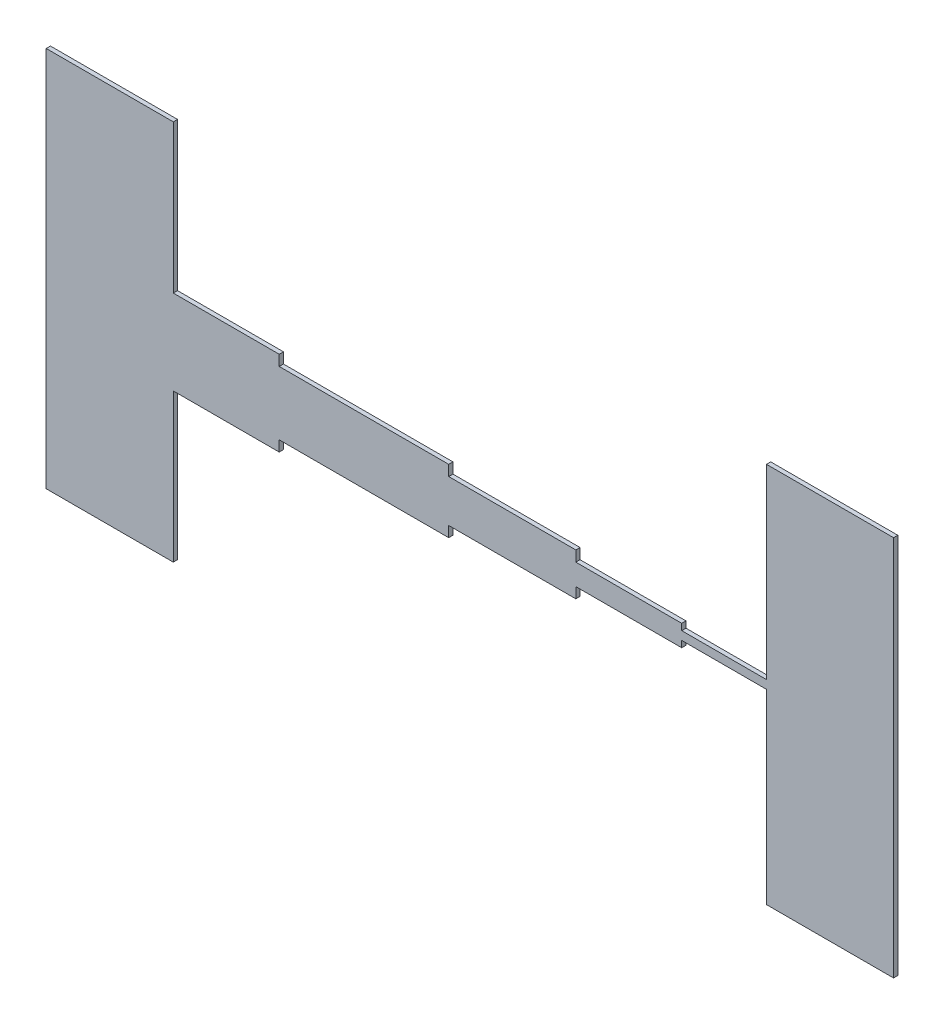
ISO-10303-21;
HEADER;
FILE_DESCRIPTION(('STEP AP214'),'2;1');
FILE_NAME('part.step','',(''),(''),'','','');
FILE_SCHEMA(('AUTOMOTIVE_DESIGN { 1 0 10303 214 1 1 1 1 }'));
ENDSEC;
DATA;
#1=APPLICATION_CONTEXT('core data for automotive mechanical design processes');
#2=APPLICATION_PROTOCOL_DEFINITION('international standard','automotive_design',2000,#1);
#3=PRODUCT_CONTEXT('',#1,'mechanical');
#4=PRODUCT('Part','Part','',(#3));
#5=PRODUCT_RELATED_PRODUCT_CATEGORY('part','',(#4));
#6=PRODUCT_DEFINITION_FORMATION('','',#4);
#7=PRODUCT_DEFINITION_CONTEXT('part definition',#1,'design');
#8=PRODUCT_DEFINITION('design','',#6,#7);
#9=PRODUCT_DEFINITION_SHAPE('','',#8);
#10=(LENGTH_UNIT() NAMED_UNIT(*) SI_UNIT(.MILLI.,.METRE.));
#11=(NAMED_UNIT(*) PLANE_ANGLE_UNIT() SI_UNIT($,.RADIAN.));
#12=(NAMED_UNIT(*) SI_UNIT($,.STERADIAN.) SOLID_ANGLE_UNIT());
#13=UNCERTAINTY_MEASURE_WITH_UNIT(LENGTH_MEASURE(1.E-05),#10,'distance_accuracy_value','');
#14=(GEOMETRIC_REPRESENTATION_CONTEXT(3) GLOBAL_UNCERTAINTY_ASSIGNED_CONTEXT((#13)) GLOBAL_UNIT_ASSIGNED_CONTEXT((#10,
#11,#12)) REPRESENTATION_CONTEXT('',''));
#15=CARTESIAN_POINT('',(0.,0.,0.));
#16=DIRECTION('',(0.,0.,1.));
#17=DIRECTION('',(1.,0.,0.));
#18=AXIS2_PLACEMENT_3D('',#15,#16,#17);
#19=CARTESIAN_POINT('',(-9507.17390524048,-4495.5,-50.05));
#20=DIRECTION('',(1.,0.,0.));
#21=DIRECTION('',(0.,0.,-1.));
#22=AXIS2_PLACEMENT_3D('',#19,#20,#21);
#23=PLANE('',#22);
#24=DIRECTION('',(0.,1.,0.));
#25=VECTOR('',#24,1.);
#26=CARTESIAN_POINT('',(-9507.17390524048,-4495.5,49.95));
#27=LINE('',#26,#25);
#28=CARTESIAN_POINT('',(-9507.17390524048,-4495.5,49.95));
#29=VERTEX_POINT('',#28);
#30=CARTESIAN_POINT('',(-9507.17390524048,4504.5,49.95));
#31=VERTEX_POINT('',#30);
#32=EDGE_CURVE('E268',#29,#31,#27,.T.);
#33=ORIENTED_EDGE('',*,*,#32,.T.);
#34=DIRECTION('',(0.,0.,1.));
#35=VECTOR('',#34,1.);
#36=CARTESIAN_POINT('',(-9507.17390524048,4504.5,-50.05));
#37=LINE('',#36,#35);
#38=CARTESIAN_POINT('',(-9507.17390524048,4504.5,-50.05));
#39=VERTEX_POINT('',#38);
#40=EDGE_CURVE('E11',#39,#31,#37,.T.);
#41=ORIENTED_EDGE('',*,*,#40,.F.);
#42=DIRECTION('',(0.,1.,0.));
#43=VECTOR('',#42,1.);
#44=CARTESIAN_POINT('',(-9507.17390524048,-4495.5,-50.05));
#45=LINE('',#44,#43);
#46=CARTESIAN_POINT('',(-9507.17390524048,-4495.5,-50.05));
#47=VERTEX_POINT('',#46);
#48=EDGE_CURVE('E366',#47,#39,#45,.T.);
#49=ORIENTED_EDGE('',*,*,#48,.F.);
#50=DIRECTION('',(0.,0.,1.));
#51=VECTOR('',#50,1.);
#52=CARTESIAN_POINT('',(-9507.17390524048,-4495.5,-50.05));
#53=LINE('',#52,#51);
#54=EDGE_CURVE('E60',#47,#29,#53,.T.);
#55=ORIENTED_EDGE('',*,*,#54,.T.);
#56=EDGE_LOOP('',(#33,#41,#49,#55));
#57=FACE_BOUND('',#56,.T.);
#58=ADVANCED_FACE('F43',(#57),#23,.F.);
#59=CARTESIAN_POINT('',(-9507.17390524048,4504.5,-50.05));
#60=DIRECTION('',(0.,-1.,0.));
#61=DIRECTION('',(0.,0.,-1.));
#62=AXIS2_PLACEMENT_3D('',#59,#60,#61);
#63=PLANE('',#62);
#64=DIRECTION('',(1.,0.,0.));
#65=VECTOR('',#64,1.);
#66=CARTESIAN_POINT('',(-9507.17390524048,4504.5,49.95));
#67=LINE('',#66,#65);
#68=CARTESIAN_POINT('',(-6507.17390524049,4504.5,49.95));
#69=VERTEX_POINT('',#68);
#70=EDGE_CURVE('E271',#31,#69,#67,.T.);
#71=ORIENTED_EDGE('',*,*,#70,.T.);
#72=DIRECTION('',(0.,0.,1.));
#73=VECTOR('',#72,1.);
#74=CARTESIAN_POINT('',(-6507.17390524049,4504.5,-50.05));
#75=LINE('',#74,#73);
#76=CARTESIAN_POINT('',(-6507.17390524049,4504.5,-50.05));
#77=VERTEX_POINT('',#76);
#78=EDGE_CURVE('E52',#77,#69,#75,.T.);
#79=ORIENTED_EDGE('',*,*,#78,.F.);
#80=DIRECTION('',(1.,0.,0.));
#81=VECTOR('',#80,1.);
#82=CARTESIAN_POINT('',(-9507.17390524048,4504.5,-50.05));
#83=LINE('',#82,#81);
#84=EDGE_CURVE('E159',#39,#77,#83,.T.);
#85=ORIENTED_EDGE('',*,*,#84,.F.);
#86=ORIENTED_EDGE('',*,*,#40,.T.);
#87=EDGE_LOOP('',(#71,#79,#85,#86));
#88=FACE_BOUND('',#87,.T.);
#89=ADVANCED_FACE('F561',(#88),#63,.F.);
#90=CARTESIAN_POINT('',(-6507.17390524049,4504.5,-50.05));
#91=DIRECTION('',(-1.,0.,0.));
#92=DIRECTION('',(0.,-1.,0.));
#93=AXIS2_PLACEMENT_3D('',#90,#91,#92);
#94=PLANE('',#93);
#95=DIRECTION('',(0.,-1.,0.));
#96=VECTOR('',#95,1.);
#97=CARTESIAN_POINT('',(-6507.17390524049,4504.5,49.95));
#98=LINE('',#97,#96);
#99=CARTESIAN_POINT('',(-6507.17390524049,1004.5,49.95));
#100=VERTEX_POINT('',#99);
#101=EDGE_CURVE('E274',#69,#100,#98,.T.);
#102=ORIENTED_EDGE('',*,*,#101,.T.);
#103=DIRECTION('',(0.,0.,1.));
#104=VECTOR('',#103,1.);
#105=CARTESIAN_POINT('',(-6507.17390524049,1004.5,-50.05));
#106=LINE('',#105,#104);
#107=CARTESIAN_POINT('',(-6507.17390524049,1004.5,-50.05));
#108=VERTEX_POINT('',#107);
#109=EDGE_CURVE('E444',#108,#100,#106,.T.);
#110=ORIENTED_EDGE('',*,*,#109,.F.);
#111=DIRECTION('',(0.,-1.,0.));
#112=VECTOR('',#111,1.);
#113=CARTESIAN_POINT('',(-6507.17390524049,4504.5,-50.05));
#114=LINE('',#113,#112);
#115=EDGE_CURVE('E454',#77,#108,#114,.T.);
#116=ORIENTED_EDGE('',*,*,#115,.F.);
#117=ORIENTED_EDGE('',*,*,#78,.T.);
#118=EDGE_LOOP('',(#102,#110,#116,#117));
#119=FACE_BOUND('',#118,.T.);
#120=ADVANCED_FACE('F452',(#119),#94,.F.);
#121=CARTESIAN_POINT('',(-6507.17390524049,1004.5,-50.05));
#122=DIRECTION('',(0.,-1.,0.));
#123=DIRECTION('',(1.,0.,0.));
#124=AXIS2_PLACEMENT_3D('',#121,#122,#123);
#125=PLANE('',#124);
#126=DIRECTION('',(1.,0.,0.));
#127=VECTOR('',#126,1.);
#128=CARTESIAN_POINT('',(-6507.17390524049,1004.5,49.95));
#129=LINE('',#128,#127);
#130=CARTESIAN_POINT('',(-4007.17390524049,1004.5,49.95));
#131=VERTEX_POINT('',#130);
#132=EDGE_CURVE('E277',#100,#131,#129,.T.);
#133=ORIENTED_EDGE('',*,*,#132,.T.);
#134=DIRECTION('',(0.,0.,1.));
#135=VECTOR('',#134,1.);
#136=CARTESIAN_POINT('',(-4007.17390524049,1004.5,-50.05));
#137=LINE('',#136,#135);
#138=CARTESIAN_POINT('',(-4007.17390524049,1004.5,-50.05));
#139=VERTEX_POINT('',#138);
#140=EDGE_CURVE('E440',#139,#131,#137,.T.);
#141=ORIENTED_EDGE('',*,*,#140,.F.);
#142=DIRECTION('',(1.,0.,0.));
#143=VECTOR('',#142,1.);
#144=CARTESIAN_POINT('',(-6507.17390524049,1004.5,-50.05));
#145=LINE('',#144,#143);
#146=EDGE_CURVE('E472',#108,#139,#145,.T.);
#147=ORIENTED_EDGE('',*,*,#146,.F.);
#148=ORIENTED_EDGE('',*,*,#109,.T.);
#149=EDGE_LOOP('',(#133,#141,#147,#148));
#150=FACE_BOUND('',#149,.T.);
#151=ADVANCED_FACE('F462',(#150),#125,.F.);
#152=CARTESIAN_POINT('',(-4007.17390524049,1004.5,-50.05));
#153=DIRECTION('',(-1.,0.,0.));
#154=DIRECTION('',(0.,0.,1.));
#155=AXIS2_PLACEMENT_3D('',#152,#153,#154);
#156=PLANE('',#155);
#157=DIRECTION('',(0.,-1.,0.));
#158=VECTOR('',#157,1.);
#159=CARTESIAN_POINT('',(-4007.17390524049,1004.5,49.95));
#160=LINE('',#159,#158);
#161=CARTESIAN_POINT('',(-4007.17390524049,754.5,49.95));
#162=VERTEX_POINT('',#161);
#163=EDGE_CURVE('E280',#131,#162,#160,.T.);
#164=ORIENTED_EDGE('',*,*,#163,.T.);
#165=DIRECTION('',(0.,0.,1.));
#166=VECTOR('',#165,1.);
#167=CARTESIAN_POINT('',(-4007.17390524049,754.5,-50.05));
#168=LINE('',#167,#166);
#169=CARTESIAN_POINT('',(-4007.17390524049,754.5,-50.05));
#170=VERTEX_POINT('',#169);
#171=EDGE_CURVE('E436',#170,#162,#168,.T.);
#172=ORIENTED_EDGE('',*,*,#171,.F.);
#173=DIRECTION('',(0.,-1.,0.));
#174=VECTOR('',#173,1.);
#175=CARTESIAN_POINT('',(-4007.17390524049,1004.5,-50.05));
#176=LINE('',#175,#174);
#177=EDGE_CURVE('E468',#139,#170,#176,.T.);
#178=ORIENTED_EDGE('',*,*,#177,.F.);
#179=ORIENTED_EDGE('',*,*,#140,.T.);
#180=EDGE_LOOP('',(#164,#172,#178,#179));
#181=FACE_BOUND('',#180,.T.);
#182=ADVANCED_FACE('F466',(#181),#156,.F.);
#183=CARTESIAN_POINT('',(-4007.17390524049,754.5,-50.05));
#184=DIRECTION('',(0.,-1.,0.));
#185=DIRECTION('',(0.,0.,-1.));
#186=AXIS2_PLACEMENT_3D('',#183,#184,#185);
#187=PLANE('',#186);
#188=DIRECTION('',(1.,0.,0.));
#189=VECTOR('',#188,1.);
#190=CARTESIAN_POINT('',(-4007.17390524049,754.5,49.95));
#191=LINE('',#190,#189);
#192=CARTESIAN_POINT('',(-7.17390524048768,754.5,49.95));
#193=VERTEX_POINT('',#192);
#194=EDGE_CURVE('E283',#162,#193,#191,.T.);
#195=ORIENTED_EDGE('',*,*,#194,.T.);
#196=DIRECTION('',(0.,0.,1.));
#197=VECTOR('',#196,1.);
#198=CARTESIAN_POINT('',(-7.17390524048768,754.5,-50.05));
#199=LINE('',#198,#197);
#200=CARTESIAN_POINT('',(-7.17390524048768,754.5,-50.05));
#201=VERTEX_POINT('',#200);
#202=EDGE_CURVE('E432',#201,#193,#199,.T.);
#203=ORIENTED_EDGE('',*,*,#202,.F.);
#204=DIRECTION('',(1.,0.,0.));
#205=VECTOR('',#204,1.);
#206=CARTESIAN_POINT('',(-4007.17390524049,754.5,-50.05));
#207=LINE('',#206,#205);
#208=EDGE_CURVE('E471',#170,#201,#207,.T.);
#209=ORIENTED_EDGE('',*,*,#208,.F.);
#210=ORIENTED_EDGE('',*,*,#171,.T.);
#211=EDGE_LOOP('',(#195,#203,#209,#210));
#212=FACE_BOUND('',#211,.T.);
#213=ADVANCED_FACE('F779',(#212),#187,.F.);
#214=CARTESIAN_POINT('',(-7.17390524048768,754.5,-50.05));
#215=DIRECTION('',(-1.,0.,0.));
#216=DIRECTION('',(0.,0.,1.));
#217=AXIS2_PLACEMENT_3D('',#214,#215,#216);
#218=PLANE('',#217);
#219=DIRECTION('',(0.,-1.,0.));
#220=VECTOR('',#219,1.);
#221=CARTESIAN_POINT('',(-7.17390524048768,754.5,49.95));
#222=LINE('',#221,#220);
#223=CARTESIAN_POINT('',(-7.17390524048768,504.5,49.95));
#224=VERTEX_POINT('',#223);
#225=EDGE_CURVE('E286',#193,#224,#222,.T.);
#226=ORIENTED_EDGE('',*,*,#225,.T.);
#227=DIRECTION('',(0.,0.,1.));
#228=VECTOR('',#227,1.);
#229=CARTESIAN_POINT('',(-7.17390524048768,504.5,-50.05));
#230=LINE('',#229,#228);
#231=CARTESIAN_POINT('',(-7.17390524048768,504.5,-50.05));
#232=VERTEX_POINT('',#231);
#233=EDGE_CURVE('E428',#232,#224,#230,.T.);
#234=ORIENTED_EDGE('',*,*,#233,.F.);
#235=DIRECTION('',(0.,-1.,0.));
#236=VECTOR('',#235,1.);
#237=CARTESIAN_POINT('',(-7.17390524048768,754.5,-50.05));
#238=LINE('',#237,#236);
#239=EDGE_CURVE('E476',#201,#232,#238,.T.);
#240=ORIENTED_EDGE('',*,*,#239,.F.);
#241=ORIENTED_EDGE('',*,*,#202,.T.);
#242=EDGE_LOOP('',(#226,#234,#240,#241));
#243=FACE_BOUND('',#242,.T.);
#244=ADVANCED_FACE('F769',(#243),#218,.F.);
#245=CARTESIAN_POINT('',(-7.17390524048768,504.5,-50.05));
#246=DIRECTION('',(0.,-1.,0.));
#247=DIRECTION('',(0.,0.,-1.));
#248=AXIS2_PLACEMENT_3D('',#245,#246,#247);
#249=PLANE('',#248);
#250=DIRECTION('',(1.,0.,0.));
#251=VECTOR('',#250,1.);
#252=CARTESIAN_POINT('',(-7.17390524048768,504.5,49.95));
#253=LINE('',#252,#251);
#254=CARTESIAN_POINT('',(2992.82609475951,504.5,49.95));
#255=VERTEX_POINT('',#254);
#256=EDGE_CURVE('E289',#224,#255,#253,.T.);
#257=ORIENTED_EDGE('',*,*,#256,.T.);
#258=DIRECTION('',(0.,0.,1.));
#259=VECTOR('',#258,1.);
#260=CARTESIAN_POINT('',(2992.82609475951,504.5,-50.05));
#261=LINE('',#260,#259);
#262=CARTESIAN_POINT('',(2992.82609475951,504.5,-50.05));
#263=VERTEX_POINT('',#262);
#264=EDGE_CURVE('E424',#263,#255,#261,.T.);
#265=ORIENTED_EDGE('',*,*,#264,.F.);
#266=DIRECTION('',(1.,0.,0.));
#267=VECTOR('',#266,1.);
#268=CARTESIAN_POINT('',(-7.17390524048768,504.5,-50.05));
#269=LINE('',#268,#267);
#270=EDGE_CURVE('E483',#232,#263,#269,.T.);
#271=ORIENTED_EDGE('',*,*,#270,.F.);
#272=ORIENTED_EDGE('',*,*,#233,.T.);
#273=EDGE_LOOP('',(#257,#265,#271,#272));
#274=FACE_BOUND('',#273,.T.);
#275=ADVANCED_FACE('F759',(#274),#249,.F.);
#276=CARTESIAN_POINT('',(2992.82609475951,504.5,-50.05));
#277=DIRECTION('',(-1.,0.,0.));
#278=DIRECTION('',(0.,0.,1.));
#279=AXIS2_PLACEMENT_3D('',#276,#277,#278);
#280=PLANE('',#279);
#281=DIRECTION('',(0.,-1.,0.));
#282=VECTOR('',#281,1.);
#283=CARTESIAN_POINT('',(2992.82609475951,504.5,49.95));
#284=LINE('',#283,#282);
#285=CARTESIAN_POINT('',(2992.82609475951,254.499999999998,49.95));
#286=VERTEX_POINT('',#285);
#287=EDGE_CURVE('E292',#255,#286,#284,.T.);
#288=ORIENTED_EDGE('',*,*,#287,.T.);
#289=DIRECTION('',(0.,0.,1.));
#290=VECTOR('',#289,1.);
#291=CARTESIAN_POINT('',(2992.82609475951,254.499999999998,-50.05));
#292=LINE('',#291,#290);
#293=CARTESIAN_POINT('',(2992.82609475951,254.499999999998,-50.05));
#294=VERTEX_POINT('',#293);
#295=EDGE_CURVE('E420',#294,#286,#292,.T.);
#296=ORIENTED_EDGE('',*,*,#295,.F.);
#297=DIRECTION('',(0.,-1.,0.));
#298=VECTOR('',#297,1.);
#299=CARTESIAN_POINT('',(2992.82609475951,504.5,-50.05));
#300=LINE('',#299,#298);
#301=EDGE_CURVE('E486',#263,#294,#300,.T.);
#302=ORIENTED_EDGE('',*,*,#301,.F.);
#303=ORIENTED_EDGE('',*,*,#264,.T.);
#304=EDGE_LOOP('',(#288,#296,#302,#303));
#305=FACE_BOUND('',#304,.T.);
#306=ADVANCED_FACE('F749',(#305),#280,.F.);
#307=CARTESIAN_POINT('',(2992.82609475951,254.499999999998,-50.05));
#308=DIRECTION('',(0.,-1.,0.));
#309=DIRECTION('',(1.,0.,0.));
#310=AXIS2_PLACEMENT_3D('',#307,#308,#309);
#311=PLANE('',#310);
#312=DIRECTION('',(1.,0.,0.));
#313=VECTOR('',#312,1.);
#314=CARTESIAN_POINT('',(2992.82609475951,254.499999999998,49.95));
#315=LINE('',#314,#313);
#316=CARTESIAN_POINT('',(5492.82609475951,254.499999999999,49.95));
#317=VERTEX_POINT('',#316);
#318=EDGE_CURVE('E295',#286,#317,#315,.T.);
#319=ORIENTED_EDGE('',*,*,#318,.T.);
#320=DIRECTION('',(0.,0.,1.));
#321=VECTOR('',#320,1.);
#322=CARTESIAN_POINT('',(5492.82609475951,254.499999999999,-50.05));
#323=LINE('',#322,#321);
#324=CARTESIAN_POINT('',(5492.82609475951,254.499999999999,-50.05));
#325=VERTEX_POINT('',#324);
#326=EDGE_CURVE('E416',#325,#317,#323,.T.);
#327=ORIENTED_EDGE('',*,*,#326,.F.);
#328=DIRECTION('',(1.,0.,0.));
#329=VECTOR('',#328,1.);
#330=CARTESIAN_POINT('',(2992.82609475951,254.499999999998,-50.05));
#331=LINE('',#330,#329);
#332=EDGE_CURVE('E489',#294,#325,#331,.T.);
#333=ORIENTED_EDGE('',*,*,#332,.F.);
#334=ORIENTED_EDGE('',*,*,#295,.T.);
#335=EDGE_LOOP('',(#319,#327,#333,#334));
#336=FACE_BOUND('',#335,.T.);
#337=ADVANCED_FACE('F739',(#336),#311,.F.);
#338=CARTESIAN_POINT('',(5492.82609475951,254.499999999999,-50.05));
#339=DIRECTION('',(-1.,0.,0.));
#340=DIRECTION('',(0.,0.,1.));
#341=AXIS2_PLACEMENT_3D('',#338,#339,#340);
#342=PLANE('',#341);
#343=DIRECTION('',(0.,-1.,0.));
#344=VECTOR('',#343,1.);
#345=CARTESIAN_POINT('',(5492.82609475951,254.499999999999,49.95));
#346=LINE('',#345,#344);
#347=CARTESIAN_POINT('',(5492.82609475951,104.5,49.95));
#348=VERTEX_POINT('',#347);
#349=EDGE_CURVE('E298',#317,#348,#346,.T.);
#350=ORIENTED_EDGE('',*,*,#349,.T.);
#351=DIRECTION('',(0.,0.,1.));
#352=VECTOR('',#351,1.);
#353=CARTESIAN_POINT('',(5492.82609475951,104.5,-50.05));
#354=LINE('',#353,#352);
#355=CARTESIAN_POINT('',(5492.82609475951,104.5,-50.05));
#356=VERTEX_POINT('',#355);
#357=EDGE_CURVE('E412',#356,#348,#354,.T.);
#358=ORIENTED_EDGE('',*,*,#357,.F.);
#359=DIRECTION('',(0.,-1.,0.));
#360=VECTOR('',#359,1.);
#361=CARTESIAN_POINT('',(5492.82609475951,254.499999999999,-50.05));
#362=LINE('',#361,#360);
#363=EDGE_CURVE('E492',#325,#356,#362,.T.);
#364=ORIENTED_EDGE('',*,*,#363,.F.);
#365=ORIENTED_EDGE('',*,*,#326,.T.);
#366=EDGE_LOOP('',(#350,#358,#364,#365));
#367=FACE_BOUND('',#366,.T.);
#368=ADVANCED_FACE('F729',(#367),#342,.F.);
#369=CARTESIAN_POINT('',(5492.82609475951,104.5,-50.05));
#370=DIRECTION('',(0.,-1.,0.));
#371=DIRECTION('',(0.,0.,-1.));
#372=AXIS2_PLACEMENT_3D('',#369,#370,#371);
#373=PLANE('',#372);
#374=DIRECTION('',(1.,0.,0.));
#375=VECTOR('',#374,1.);
#376=CARTESIAN_POINT('',(5492.82609475951,104.5,49.95));
#377=LINE('',#376,#375);
#378=CARTESIAN_POINT('',(7492.82609475952,104.5,49.95));
#379=VERTEX_POINT('',#378);
#380=EDGE_CURVE('E301',#348,#379,#377,.T.);
#381=ORIENTED_EDGE('',*,*,#380,.T.);
#382=DIRECTION('',(0.,0.,1.));
#383=VECTOR('',#382,1.);
#384=CARTESIAN_POINT('',(7492.82609475952,104.5,-50.05));
#385=LINE('',#384,#383);
#386=CARTESIAN_POINT('',(7492.82609475952,104.5,-50.05));
#387=VERTEX_POINT('',#386);
#388=EDGE_CURVE('E409',#387,#379,#385,.T.);
#389=ORIENTED_EDGE('',*,*,#388,.F.);
#390=DIRECTION('',(1.,0.,0.));
#391=VECTOR('',#390,1.);
#392=CARTESIAN_POINT('',(5492.82609475951,104.5,-50.05));
#393=LINE('',#392,#391);
#394=EDGE_CURVE('E495',#356,#387,#393,.T.);
#395=ORIENTED_EDGE('',*,*,#394,.F.);
#396=ORIENTED_EDGE('',*,*,#357,.T.);
#397=EDGE_LOOP('',(#381,#389,#395,#396));
#398=FACE_BOUND('',#397,.T.);
#399=ADVANCED_FACE('F719',(#398),#373,.F.);
#400=CARTESIAN_POINT('',(7492.82609475952,4504.5,-50.05));
#401=DIRECTION('',(-1.,0.,0.));
#402=DIRECTION('',(0.,0.,1.));
#403=AXIS2_PLACEMENT_3D('',#400,#401,#402);
#404=PLANE('',#403);
#405=DIRECTION('',(0.,-1.,0.));
#406=VECTOR('',#405,1.);
#407=CARTESIAN_POINT('',(7492.82609475952,4504.5,49.95));
#408=LINE('',#407,#406);
#409=CARTESIAN_POINT('',(7492.82609475952,4504.5,49.95));
#410=VERTEX_POINT('',#409);
#411=EDGE_CURVE('E305',#410,#379,#408,.T.);
#412=ORIENTED_EDGE('',*,*,#411,.F.);
#413=DIRECTION('',(0.,0.,1.));
#414=VECTOR('',#413,1.);
#415=CARTESIAN_POINT('',(7492.82609475952,4504.5,-50.05));
#416=LINE('',#415,#414);
#417=CARTESIAN_POINT('',(7492.82609475952,4504.5,-50.05));
#418=VERTEX_POINT('',#417);
#419=EDGE_CURVE('E406',#418,#410,#416,.T.);
#420=ORIENTED_EDGE('',*,*,#419,.F.);
#421=DIRECTION('',(0.,-1.,0.));
#422=VECTOR('',#421,1.);
#423=CARTESIAN_POINT('',(7492.82609475952,4504.5,-50.05));
#424=LINE('',#423,#422);
#425=EDGE_CURVE('E498',#418,#387,#424,.T.);
#426=ORIENTED_EDGE('',*,*,#425,.T.);
#427=ORIENTED_EDGE('',*,*,#388,.T.);
#428=EDGE_LOOP('',(#412,#420,#426,#427));
#429=FACE_BOUND('',#428,.T.);
#430=ADVANCED_FACE('F709',(#429),#404,.T.);
#431=CARTESIAN_POINT('',(7492.82609475952,4504.5,-50.05));
#432=DIRECTION('',(0.,-1.,0.));
#433=DIRECTION('',(0.,0.,-1.));
#434=AXIS2_PLACEMENT_3D('',#431,#432,#433);
#435=PLANE('',#434);
#436=DIRECTION('',(1.,0.,0.));
#437=VECTOR('',#436,1.);
#438=CARTESIAN_POINT('',(7492.82609475952,4504.5,49.95));
#439=LINE('',#438,#437);
#440=CARTESIAN_POINT('',(10492.8260947595,4504.5,49.95));
#441=VERTEX_POINT('',#440);
#442=EDGE_CURVE('E309',#410,#441,#439,.T.);
#443=ORIENTED_EDGE('',*,*,#442,.T.);
#444=DIRECTION('',(0.,0.,1.));
#445=VECTOR('',#444,1.);
#446=CARTESIAN_POINT('',(10492.8260947595,4504.5,-50.05));
#447=LINE('',#446,#445);
#448=CARTESIAN_POINT('',(10492.8260947595,4504.5,-50.05));
#449=VERTEX_POINT('',#448);
#450=EDGE_CURVE('E403',#449,#441,#447,.T.);
#451=ORIENTED_EDGE('',*,*,#450,.F.);
#452=DIRECTION('',(1.,0.,0.));
#453=VECTOR('',#452,1.);
#454=CARTESIAN_POINT('',(7492.82609475952,4504.5,-50.05));
#455=LINE('',#454,#453);
#456=EDGE_CURVE('E502',#418,#449,#455,.T.);
#457=ORIENTED_EDGE('',*,*,#456,.F.);
#458=ORIENTED_EDGE('',*,*,#419,.T.);
#459=EDGE_LOOP('',(#443,#451,#457,#458));
#460=FACE_BOUND('',#459,.T.);
#461=ADVANCED_FACE('F699',(#460),#435,.F.);
#462=CARTESIAN_POINT('',(10492.8260947595,-4495.5,-50.05));
#463=DIRECTION('',(1.,0.,0.));
#464=DIRECTION('',(0.,0.,-1.));
#465=AXIS2_PLACEMENT_3D('',#462,#463,#464);
#466=PLANE('',#465);
#467=DIRECTION('',(0.,1.,0.));
#468=VECTOR('',#467,1.);
#469=CARTESIAN_POINT('',(10492.8260947595,-4495.5,49.95));
#470=LINE('',#469,#468);
#471=CARTESIAN_POINT('',(10492.8260947595,-4495.5,49.95));
#472=VERTEX_POINT('',#471);
#473=EDGE_CURVE('E313',#472,#441,#470,.T.);
#474=ORIENTED_EDGE('',*,*,#473,.F.);
#475=DIRECTION('',(0.,0.,1.));
#476=VECTOR('',#475,1.);
#477=CARTESIAN_POINT('',(10492.8260947595,-4495.5,-50.05));
#478=LINE('',#477,#476);
#479=CARTESIAN_POINT('',(10492.8260947595,-4495.5,-50.05));
#480=VERTEX_POINT('',#479);
#481=EDGE_CURVE('E400',#480,#472,#478,.T.);
#482=ORIENTED_EDGE('',*,*,#481,.F.);
#483=DIRECTION('',(0.,1.,0.));
#484=VECTOR('',#483,1.);
#485=CARTESIAN_POINT('',(10492.8260947595,-4495.5,-50.05));
#486=LINE('',#485,#484);
#487=EDGE_CURVE('E505',#480,#449,#486,.T.);
#488=ORIENTED_EDGE('',*,*,#487,.T.);
#489=ORIENTED_EDGE('',*,*,#450,.T.);
#490=EDGE_LOOP('',(#474,#482,#488,#489));
#491=FACE_BOUND('',#490,.T.);
#492=ADVANCED_FACE('F689',(#491),#466,.T.);
#493=CARTESIAN_POINT('',(7492.82609475952,-4495.5,-50.05));
#494=DIRECTION('',(0.,-1.,0.));
#495=DIRECTION('',(1.,0.,0.));
#496=AXIS2_PLACEMENT_3D('',#493,#494,#495);
#497=PLANE('',#496);
#498=DIRECTION('',(1.,0.,0.));
#499=VECTOR('',#498,1.);
#500=CARTESIAN_POINT('',(7492.82609475952,-4495.5,49.95));
#501=LINE('',#500,#499);
#502=CARTESIAN_POINT('',(7492.82609475952,-4495.5,49.95));
#503=VERTEX_POINT('',#502);
#504=EDGE_CURVE('E317',#503,#472,#501,.T.);
#505=ORIENTED_EDGE('',*,*,#504,.F.);
#506=DIRECTION('',(0.,0.,1.));
#507=VECTOR('',#506,1.);
#508=CARTESIAN_POINT('',(7492.82609475952,-4495.5,-50.05));
#509=LINE('',#508,#507);
#510=CARTESIAN_POINT('',(7492.82609475952,-4495.5,-50.05));
#511=VERTEX_POINT('',#510);
#512=EDGE_CURVE('E397',#511,#503,#509,.T.);
#513=ORIENTED_EDGE('',*,*,#512,.F.);
#514=DIRECTION('',(1.,0.,0.));
#515=VECTOR('',#514,1.);
#516=CARTESIAN_POINT('',(7492.82609475952,-4495.5,-50.05));
#517=LINE('',#516,#515);
#518=EDGE_CURVE('E509',#511,#480,#517,.T.);
#519=ORIENTED_EDGE('',*,*,#518,.T.);
#520=ORIENTED_EDGE('',*,*,#481,.T.);
#521=EDGE_LOOP('',(#505,#513,#519,#520));
#522=FACE_BOUND('',#521,.T.);
#523=ADVANCED_FACE('F679',(#522),#497,.T.);
#524=CARTESIAN_POINT('',(7492.82609475952,-95.5000000000001,-50.05));
#525=DIRECTION('',(-1.,0.,0.));
#526=DIRECTION('',(0.,0.,1.));
#527=AXIS2_PLACEMENT_3D('',#524,#525,#526);
#528=PLANE('',#527);
#529=DIRECTION('',(0.,-1.,0.));
#530=VECTOR('',#529,1.);
#531=CARTESIAN_POINT('',(7492.82609475952,-95.5000000000001,49.95));
#532=LINE('',#531,#530);
#533=CARTESIAN_POINT('',(7492.82609475952,-95.5000000000001,49.95));
#534=VERTEX_POINT('',#533);
#535=EDGE_CURVE('E321',#534,#503,#532,.T.);
#536=ORIENTED_EDGE('',*,*,#535,.F.);
#537=DIRECTION('',(0.,0.,1.));
#538=VECTOR('',#537,1.);
#539=CARTESIAN_POINT('',(7492.82609475952,-95.5000000000001,-50.05));
#540=LINE('',#539,#538);
#541=CARTESIAN_POINT('',(7492.82609475952,-95.5000000000001,-50.05));
#542=VERTEX_POINT('',#541);
#543=EDGE_CURVE('E394',#542,#534,#540,.T.);
#544=ORIENTED_EDGE('',*,*,#543,.F.);
#545=DIRECTION('',(0.,-1.,0.));
#546=VECTOR('',#545,1.);
#547=CARTESIAN_POINT('',(7492.82609475952,-95.5000000000001,-50.05));
#548=LINE('',#547,#546);
#549=EDGE_CURVE('E513',#542,#511,#548,.T.);
#550=ORIENTED_EDGE('',*,*,#549,.T.);
#551=ORIENTED_EDGE('',*,*,#512,.T.);
#552=EDGE_LOOP('',(#536,#544,#550,#551));
#553=FACE_BOUND('',#552,.T.);
#554=ADVANCED_FACE('F669',(#553),#528,.T.);
#555=CARTESIAN_POINT('',(5492.82609475951,-95.500000000001,-50.05));
#556=DIRECTION('',(0.,-1.,0.));
#557=DIRECTION('',(1.,0.,0.));
#558=AXIS2_PLACEMENT_3D('',#555,#556,#557);
#559=PLANE('',#558);
#560=DIRECTION('',(1.,0.,0.));
#561=VECTOR('',#560,1.);
#562=CARTESIAN_POINT('',(5492.82609475951,-95.500000000001,49.95));
#563=LINE('',#562,#561);
#564=CARTESIAN_POINT('',(5492.82609475951,-95.500000000001,49.95));
#565=VERTEX_POINT('',#564);
#566=EDGE_CURVE('E325',#565,#534,#563,.T.);
#567=ORIENTED_EDGE('',*,*,#566,.F.);
#568=DIRECTION('',(0.,0.,1.));
#569=VECTOR('',#568,1.);
#570=CARTESIAN_POINT('',(5492.82609475951,-95.500000000001,-50.05));
#571=LINE('',#570,#569);
#572=CARTESIAN_POINT('',(5492.82609475951,-95.500000000001,-50.05));
#573=VERTEX_POINT('',#572);
#574=EDGE_CURVE('E391',#573,#565,#571,.T.);
#575=ORIENTED_EDGE('',*,*,#574,.F.);
#576=DIRECTION('',(1.,0.,0.));
#577=VECTOR('',#576,1.);
#578=CARTESIAN_POINT('',(5492.82609475951,-95.500000000001,-50.05));
#579=LINE('',#578,#577);
#580=EDGE_CURVE('E517',#573,#542,#579,.T.);
#581=ORIENTED_EDGE('',*,*,#580,.T.);
#582=ORIENTED_EDGE('',*,*,#543,.T.);
#583=EDGE_LOOP('',(#567,#575,#581,#582));
#584=FACE_BOUND('',#583,.T.);
#585=ADVANCED_FACE('F659',(#584),#559,.T.);
#586=CARTESIAN_POINT('',(5492.82609475951,-95.500000000001,-50.05));
#587=DIRECTION('',(-1.,0.,0.));
#588=DIRECTION('',(0.,0.,1.));
#589=AXIS2_PLACEMENT_3D('',#586,#587,#588);
#590=PLANE('',#589);
#591=DIRECTION('',(0.,-1.,0.));
#592=VECTOR('',#591,1.);
#593=CARTESIAN_POINT('',(5492.82609475951,-95.500000000001,49.95));
#594=LINE('',#593,#592);
#595=CARTESIAN_POINT('',(5492.82609475951,-245.500000000001,49.95));
#596=VERTEX_POINT('',#595);
#597=EDGE_CURVE('E329',#565,#596,#594,.T.);
#598=ORIENTED_EDGE('',*,*,#597,.T.);
#599=DIRECTION('',(0.,0.,1.));
#600=VECTOR('',#599,1.);
#601=CARTESIAN_POINT('',(5492.82609475951,-245.500000000001,-50.05));
#602=LINE('',#601,#600);
#603=CARTESIAN_POINT('',(5492.82609475951,-245.500000000001,-50.05));
#604=VERTEX_POINT('',#603);
#605=EDGE_CURVE('E388',#604,#596,#602,.T.);
#606=ORIENTED_EDGE('',*,*,#605,.F.);
#607=DIRECTION('',(0.,-1.,0.));
#608=VECTOR('',#607,1.);
#609=CARTESIAN_POINT('',(5492.82609475951,-95.500000000001,-50.05));
#610=LINE('',#609,#608);
#611=EDGE_CURVE('E521',#573,#604,#610,.T.);
#612=ORIENTED_EDGE('',*,*,#611,.F.);
#613=ORIENTED_EDGE('',*,*,#574,.T.);
#614=EDGE_LOOP('',(#598,#606,#612,#613));
#615=FACE_BOUND('',#614,.T.);
#616=ADVANCED_FACE('F649',(#615),#590,.F.);
#617=CARTESIAN_POINT('',(2992.82609475951,-245.500000000001,-50.05));
#618=DIRECTION('',(0.,-1.,0.));
#619=DIRECTION('',(0.,0.,-1.));
#620=AXIS2_PLACEMENT_3D('',#617,#618,#619);
#621=PLANE('',#620);
#622=DIRECTION('',(1.,0.,0.));
#623=VECTOR('',#622,1.);
#624=CARTESIAN_POINT('',(2992.82609475951,-245.500000000001,49.95));
#625=LINE('',#624,#623);
#626=CARTESIAN_POINT('',(2992.82609475951,-245.500000000001,49.95));
#627=VERTEX_POINT('',#626);
#628=EDGE_CURVE('E333',#627,#596,#625,.T.);
#629=ORIENTED_EDGE('',*,*,#628,.F.);
#630=DIRECTION('',(0.,0.,1.));
#631=VECTOR('',#630,1.);
#632=CARTESIAN_POINT('',(2992.82609475951,-245.500000000001,-50.05));
#633=LINE('',#632,#631);
#634=CARTESIAN_POINT('',(2992.82609475951,-245.500000000001,-50.05));
#635=VERTEX_POINT('',#634);
#636=EDGE_CURVE('E385',#635,#627,#633,.T.);
#637=ORIENTED_EDGE('',*,*,#636,.F.);
#638=DIRECTION('',(1.,0.,0.));
#639=VECTOR('',#638,1.);
#640=CARTESIAN_POINT('',(2992.82609475951,-245.500000000001,-50.05));
#641=LINE('',#640,#639);
#642=EDGE_CURVE('E524',#635,#604,#641,.T.);
#643=ORIENTED_EDGE('',*,*,#642,.T.);
#644=ORIENTED_EDGE('',*,*,#605,.T.);
#645=EDGE_LOOP('',(#629,#637,#643,#644));
#646=FACE_BOUND('',#645,.T.);
#647=ADVANCED_FACE('F639',(#646),#621,.T.);
#648=CARTESIAN_POINT('',(2992.82609475951,-245.500000000001,-50.05));
#649=DIRECTION('',(-1.,0.,0.));
#650=DIRECTION('',(0.,0.,1.));
#651=AXIS2_PLACEMENT_3D('',#648,#649,#650);
#652=PLANE('',#651);
#653=DIRECTION('',(0.,-1.,0.));
#654=VECTOR('',#653,1.);
#655=CARTESIAN_POINT('',(2992.82609475951,-245.500000000001,49.95));
#656=LINE('',#655,#654);
#657=CARTESIAN_POINT('',(2992.82609475951,-495.5,49.95));
#658=VERTEX_POINT('',#657);
#659=EDGE_CURVE('E337',#627,#658,#656,.T.);
#660=ORIENTED_EDGE('',*,*,#659,.T.);
#661=DIRECTION('',(0.,0.,1.));
#662=VECTOR('',#661,1.);
#663=CARTESIAN_POINT('',(2992.82609475951,-495.5,-50.05));
#664=LINE('',#663,#662);
#665=CARTESIAN_POINT('',(2992.82609475951,-495.5,-50.05));
#666=VERTEX_POINT('',#665);
#667=EDGE_CURVE('E382',#666,#658,#664,.T.);
#668=ORIENTED_EDGE('',*,*,#667,.F.);
#669=DIRECTION('',(0.,-1.,0.));
#670=VECTOR('',#669,1.);
#671=CARTESIAN_POINT('',(2992.82609475951,-245.500000000001,-50.05));
#672=LINE('',#671,#670);
#673=EDGE_CURVE('E528',#635,#666,#672,.T.);
#674=ORIENTED_EDGE('',*,*,#673,.F.);
#675=ORIENTED_EDGE('',*,*,#636,.T.);
#676=EDGE_LOOP('',(#660,#668,#674,#675));
#677=FACE_BOUND('',#676,.T.);
#678=ADVANCED_FACE('F629',(#677),#652,.F.);
#679=CARTESIAN_POINT('',(-7.17390524048768,-495.499999999999,-50.05));
#680=DIRECTION('',(0.,-1.,0.));
#681=DIRECTION('',(1.,0.,0.));
#682=AXIS2_PLACEMENT_3D('',#679,#680,#681);
#683=PLANE('',#682);
#684=DIRECTION('',(1.,0.,0.));
#685=VECTOR('',#684,1.);
#686=CARTESIAN_POINT('',(-7.17390524048768,-495.499999999999,49.95));
#687=LINE('',#686,#685);
#688=CARTESIAN_POINT('',(-7.17390524048768,-495.499999999999,49.95));
#689=VERTEX_POINT('',#688);
#690=EDGE_CURVE('E341',#689,#658,#687,.T.);
#691=ORIENTED_EDGE('',*,*,#690,.F.);
#692=DIRECTION('',(0.,0.,1.));
#693=VECTOR('',#692,1.);
#694=CARTESIAN_POINT('',(-7.17390524048768,-495.499999999999,-50.05));
#695=LINE('',#694,#693);
#696=CARTESIAN_POINT('',(-7.17390524048768,-495.499999999999,-50.05));
#697=VERTEX_POINT('',#696);
#698=EDGE_CURVE('E379',#697,#689,#695,.T.);
#699=ORIENTED_EDGE('',*,*,#698,.F.);
#700=DIRECTION('',(1.,0.,0.));
#701=VECTOR('',#700,1.);
#702=CARTESIAN_POINT('',(-7.17390524048768,-495.499999999999,-50.05));
#703=LINE('',#702,#701);
#704=EDGE_CURVE('E531',#697,#666,#703,.T.);
#705=ORIENTED_EDGE('',*,*,#704,.T.);
#706=ORIENTED_EDGE('',*,*,#667,.T.);
#707=EDGE_LOOP('',(#691,#699,#705,#706));
#708=FACE_BOUND('',#707,.T.);
#709=ADVANCED_FACE('F620',(#708),#683,.T.);
#710=CARTESIAN_POINT('',(-7.17390524048768,-495.499999999999,-50.05));
#711=DIRECTION('',(-1.,0.,0.));
#712=DIRECTION('',(0.,0.,1.));
#713=AXIS2_PLACEMENT_3D('',#710,#711,#712);
#714=PLANE('',#713);
#715=DIRECTION('',(0.,-1.,0.));
#716=VECTOR('',#715,1.);
#717=CARTESIAN_POINT('',(-7.17390524048768,-495.499999999999,49.95));
#718=LINE('',#717,#716);
#719=CARTESIAN_POINT('',(-7.17390524048768,-745.5,49.95));
#720=VERTEX_POINT('',#719);
#721=EDGE_CURVE('E345',#689,#720,#718,.T.);
#722=ORIENTED_EDGE('',*,*,#721,.T.);
#723=DIRECTION('',(0.,0.,1.));
#724=VECTOR('',#723,1.);
#725=CARTESIAN_POINT('',(-7.17390524048768,-745.5,-50.05));
#726=LINE('',#725,#724);
#727=CARTESIAN_POINT('',(-7.17390524048768,-745.5,-50.05));
#728=VERTEX_POINT('',#727);
#729=EDGE_CURVE('E376',#728,#720,#726,.T.);
#730=ORIENTED_EDGE('',*,*,#729,.F.);
#731=DIRECTION('',(0.,-1.,0.));
#732=VECTOR('',#731,1.);
#733=CARTESIAN_POINT('',(-7.17390524048768,-495.499999999999,-50.05));
#734=LINE('',#733,#732);
#735=EDGE_CURVE('E535',#697,#728,#734,.T.);
#736=ORIENTED_EDGE('',*,*,#735,.F.);
#737=ORIENTED_EDGE('',*,*,#698,.T.);
#738=EDGE_LOOP('',(#722,#730,#736,#737));
#739=FACE_BOUND('',#738,.T.);
#740=ADVANCED_FACE('F546',(#739),#714,.F.);
#741=CARTESIAN_POINT('',(-4007.17390524049,-745.5,-50.05));
#742=DIRECTION('',(0.,-1.,0.));
#743=DIRECTION('',(0.,0.,-1.));
#744=AXIS2_PLACEMENT_3D('',#741,#742,#743);
#745=PLANE('',#744);
#746=DIRECTION('',(1.,0.,0.));
#747=VECTOR('',#746,1.);
#748=CARTESIAN_POINT('',(-4007.17390524049,-745.5,49.95));
#749=LINE('',#748,#747);
#750=CARTESIAN_POINT('',(-4007.17390524049,-745.5,49.95));
#751=VERTEX_POINT('',#750);
#752=EDGE_CURVE('E349',#751,#720,#749,.T.);
#753=ORIENTED_EDGE('',*,*,#752,.F.);
#754=DIRECTION('',(0.,0.,1.));
#755=VECTOR('',#754,1.);
#756=CARTESIAN_POINT('',(-4007.17390524049,-745.5,-50.05));
#757=LINE('',#756,#755);
#758=CARTESIAN_POINT('',(-4007.17390524049,-745.5,-50.05));
#759=VERTEX_POINT('',#758);
#760=EDGE_CURVE('E373',#759,#751,#757,.T.);
#761=ORIENTED_EDGE('',*,*,#760,.F.);
#762=DIRECTION('',(1.,0.,0.));
#763=VECTOR('',#762,1.);
#764=CARTESIAN_POINT('',(-4007.17390524049,-745.5,-50.05));
#765=LINE('',#764,#763);
#766=EDGE_CURVE('E262',#759,#728,#765,.T.);
#767=ORIENTED_EDGE('',*,*,#766,.T.);
#768=ORIENTED_EDGE('',*,*,#729,.T.);
#769=EDGE_LOOP('',(#753,#761,#767,#768));
#770=FACE_BOUND('',#769,.T.);
#771=ADVANCED_FACE('F541',(#770),#745,.T.);
#772=CARTESIAN_POINT('',(-4007.17390524049,-745.5,-50.05));
#773=DIRECTION('',(-1.,0.,0.));
#774=DIRECTION('',(0.,0.,1.));
#775=AXIS2_PLACEMENT_3D('',#772,#773,#774);
#776=PLANE('',#775);
#777=DIRECTION('',(0.,-1.,0.));
#778=VECTOR('',#777,1.);
#779=CARTESIAN_POINT('',(-4007.17390524049,-745.5,49.95));
#780=LINE('',#779,#778);
#781=CARTESIAN_POINT('',(-4007.17390524049,-995.5,49.95));
#782=VERTEX_POINT('',#781);
#783=EDGE_CURVE('E353',#751,#782,#780,.T.);
#784=ORIENTED_EDGE('',*,*,#783,.T.);
#785=DIRECTION('',(0.,0.,1.));
#786=VECTOR('',#785,1.);
#787=CARTESIAN_POINT('',(-4007.17390524049,-995.5,-50.05));
#788=LINE('',#787,#786);
#789=CARTESIAN_POINT('',(-4007.17390524049,-995.5,-50.05));
#790=VERTEX_POINT('',#789);
#791=EDGE_CURVE('E245',#790,#782,#788,.T.);
#792=ORIENTED_EDGE('',*,*,#791,.F.);
#793=DIRECTION('',(0.,-1.,0.));
#794=VECTOR('',#793,1.);
#795=CARTESIAN_POINT('',(-4007.17390524049,-745.5,-50.05));
#796=LINE('',#795,#794);
#797=EDGE_CURVE('E257',#759,#790,#796,.T.);
#798=ORIENTED_EDGE('',*,*,#797,.F.);
#799=ORIENTED_EDGE('',*,*,#760,.T.);
#800=EDGE_LOOP('',(#784,#792,#798,#799));
#801=FACE_BOUND('',#800,.T.);
#802=ADVANCED_FACE('F551',(#801),#776,.F.);
#803=CARTESIAN_POINT('',(-6507.17390524049,-995.5,-50.05));
#804=DIRECTION('',(0.,-1.,0.));
#805=DIRECTION('',(0.,0.,-1.));
#806=AXIS2_PLACEMENT_3D('',#803,#804,#805);
#807=PLANE('',#806);
#808=DIRECTION('',(1.,0.,0.));
#809=VECTOR('',#808,1.);
#810=CARTESIAN_POINT('',(-6507.17390524049,-995.5,49.95));
#811=LINE('',#810,#809);
#812=CARTESIAN_POINT('',(-6507.17390524049,-995.5,49.95));
#813=VERTEX_POINT('',#812);
#814=EDGE_CURVE('E241',#813,#782,#811,.T.);
#815=ORIENTED_EDGE('',*,*,#814,.F.);
#816=DIRECTION('',(0.,0.,1.));
#817=VECTOR('',#816,1.);
#818=CARTESIAN_POINT('',(-6507.17390524049,-995.5,-50.05));
#819=LINE('',#818,#817);
#820=CARTESIAN_POINT('',(-6507.17390524049,-995.5,-50.05));
#821=VERTEX_POINT('',#820);
#822=EDGE_CURVE('E235',#821,#813,#819,.T.);
#823=ORIENTED_EDGE('',*,*,#822,.F.);
#824=DIRECTION('',(1.,0.,0.));
#825=VECTOR('',#824,1.);
#826=CARTESIAN_POINT('',(-6507.17390524049,-995.5,-50.05));
#827=LINE('',#826,#825);
#828=EDGE_CURVE('E239',#821,#790,#827,.T.);
#829=ORIENTED_EDGE('',*,*,#828,.T.);
#830=ORIENTED_EDGE('',*,*,#791,.T.);
#831=EDGE_LOOP('',(#815,#823,#829,#830));
#832=FACE_BOUND('',#831,.T.);
#833=ADVANCED_FACE('F237',(#832),#807,.T.);
#834=CARTESIAN_POINT('',(-6507.17390524049,-995.5,-50.05));
#835=DIRECTION('',(-1.,0.,0.));
#836=DIRECTION('',(0.,-1.,0.));
#837=AXIS2_PLACEMENT_3D('',#834,#835,#836);
#838=PLANE('',#837);
#839=DIRECTION('',(0.,-1.,0.));
#840=VECTOR('',#839,1.);
#841=CARTESIAN_POINT('',(-6507.17390524049,-995.5,49.95));
#842=LINE('',#841,#840);
#843=CARTESIAN_POINT('',(-6507.17390524048,-4495.5,49.95));
#844=VERTEX_POINT('',#843);
#845=EDGE_CURVE('E359',#813,#844,#842,.T.);
#846=ORIENTED_EDGE('',*,*,#845,.T.);
#847=DIRECTION('',(0.,0.,1.));
#848=VECTOR('',#847,1.);
#849=CARTESIAN_POINT('',(-6507.17390524048,-4495.5,-50.05));
#850=LINE('',#849,#848);
#851=CARTESIAN_POINT('',(-6507.17390524048,-4495.5,-50.05));
#852=VERTEX_POINT('',#851);
#853=EDGE_CURVE('E147',#852,#844,#850,.T.);
#854=ORIENTED_EDGE('',*,*,#853,.F.);
#855=DIRECTION('',(0.,-1.,0.));
#856=VECTOR('',#855,1.);
#857=CARTESIAN_POINT('',(-6507.17390524049,-995.5,-50.05));
#858=LINE('',#857,#856);
#859=EDGE_CURVE('E247',#821,#852,#858,.T.);
#860=ORIENTED_EDGE('',*,*,#859,.F.);
#861=ORIENTED_EDGE('',*,*,#822,.T.);
#862=EDGE_LOOP('',(#846,#854,#860,#861));
#863=FACE_BOUND('',#862,.T.);
#864=ADVANCED_FACE('F248',(#863),#838,.F.);
#865=CARTESIAN_POINT('',(-9507.17390524048,-4495.5,-50.05));
#866=DIRECTION('',(0.,-1.,0.));
#867=DIRECTION('',(1.,0.,0.));
#868=AXIS2_PLACEMENT_3D('',#865,#866,#867);
#869=PLANE('',#868);
#870=DIRECTION('',(1.,0.,0.));
#871=VECTOR('',#870,1.);
#872=CARTESIAN_POINT('',(-9507.17390524048,-4495.5,49.95));
#873=LINE('',#872,#871);
#874=EDGE_CURVE('E362',#29,#844,#873,.T.);
#875=ORIENTED_EDGE('',*,*,#874,.F.);
#876=ORIENTED_EDGE('',*,*,#54,.F.);
#877=DIRECTION('',(1.,0.,0.));
#878=VECTOR('',#877,1.);
#879=CARTESIAN_POINT('',(-9507.17390524048,-4495.5,-50.05));
#880=LINE('',#879,#878);
#881=EDGE_CURVE('E252',#47,#852,#880,.T.);
#882=ORIENTED_EDGE('',*,*,#881,.T.);
#883=ORIENTED_EDGE('',*,*,#853,.T.);
#884=EDGE_LOOP('',(#875,#876,#882,#883));
#885=FACE_BOUND('',#884,.T.);
#886=ADVANCED_FACE('F566',(#885),#869,.T.);
#887=CARTESIAN_POINT('',(-9507.17390524048,-4495.5,-50.05));
#888=DIRECTION('',(0.,0.,-1.));
#889=DIRECTION('',(-1.,0.,0.));
#890=AXIS2_PLACEMENT_3D('',#887,#888,#889);
#891=PLANE('',#890);
#892=ORIENTED_EDGE('',*,*,#48,.T.);
#893=ORIENTED_EDGE('',*,*,#84,.T.);
#894=ORIENTED_EDGE('',*,*,#115,.T.);
#895=ORIENTED_EDGE('',*,*,#146,.T.);
#896=ORIENTED_EDGE('',*,*,#177,.T.);
#897=ORIENTED_EDGE('',*,*,#208,.T.);
#898=ORIENTED_EDGE('',*,*,#239,.T.);
#899=ORIENTED_EDGE('',*,*,#270,.T.);
#900=ORIENTED_EDGE('',*,*,#301,.T.);
#901=ORIENTED_EDGE('',*,*,#332,.T.);
#902=ORIENTED_EDGE('',*,*,#363,.T.);
#903=ORIENTED_EDGE('',*,*,#394,.T.);
#904=ORIENTED_EDGE('',*,*,#425,.F.);
#905=ORIENTED_EDGE('',*,*,#456,.T.);
#906=ORIENTED_EDGE('',*,*,#487,.F.);
#907=ORIENTED_EDGE('',*,*,#518,.F.);
#908=ORIENTED_EDGE('',*,*,#549,.F.);
#909=ORIENTED_EDGE('',*,*,#580,.F.);
#910=ORIENTED_EDGE('',*,*,#611,.T.);
#911=ORIENTED_EDGE('',*,*,#642,.F.);
#912=ORIENTED_EDGE('',*,*,#673,.T.);
#913=ORIENTED_EDGE('',*,*,#704,.F.);
#914=ORIENTED_EDGE('',*,*,#735,.T.);
#915=ORIENTED_EDGE('',*,*,#766,.F.);
#916=ORIENTED_EDGE('',*,*,#797,.T.);
#917=ORIENTED_EDGE('',*,*,#828,.F.);
#918=ORIENTED_EDGE('',*,*,#859,.T.);
#919=ORIENTED_EDGE('',*,*,#881,.F.);
#920=EDGE_LOOP('',(#892,#893,#894,#895,#896,#897,#898,#899,#900,#901,#902,#903,#904,#905,#906,
#907,#908,#909,#910,#911,#912,#913,#914,#915,#916,#917,#918,#919));
#921=FACE_BOUND('',#920,.T.);
#922=ADVANCED_FACE('F254',(#921),#891,.T.);
#923=CARTESIAN_POINT('',(-9507.17390524048,-4495.5,49.95));
#924=DIRECTION('',(0.,0.,-1.));
#925=DIRECTION('',(-1.,0.,0.));
#926=AXIS2_PLACEMENT_3D('',#923,#924,#925);
#927=PLANE('',#926);
#928=ORIENTED_EDGE('',*,*,#32,.F.);
#929=ORIENTED_EDGE('',*,*,#874,.T.);
#930=ORIENTED_EDGE('',*,*,#845,.F.);
#931=ORIENTED_EDGE('',*,*,#814,.T.);
#932=ORIENTED_EDGE('',*,*,#783,.F.);
#933=ORIENTED_EDGE('',*,*,#752,.T.);
#934=ORIENTED_EDGE('',*,*,#721,.F.);
#935=ORIENTED_EDGE('',*,*,#690,.T.);
#936=ORIENTED_EDGE('',*,*,#659,.F.);
#937=ORIENTED_EDGE('',*,*,#628,.T.);
#938=ORIENTED_EDGE('',*,*,#597,.F.);
#939=ORIENTED_EDGE('',*,*,#566,.T.);
#940=ORIENTED_EDGE('',*,*,#535,.T.);
#941=ORIENTED_EDGE('',*,*,#504,.T.);
#942=ORIENTED_EDGE('',*,*,#473,.T.);
#943=ORIENTED_EDGE('',*,*,#442,.F.);
#944=ORIENTED_EDGE('',*,*,#411,.T.);
#945=ORIENTED_EDGE('',*,*,#380,.F.);
#946=ORIENTED_EDGE('',*,*,#349,.F.);
#947=ORIENTED_EDGE('',*,*,#318,.F.);
#948=ORIENTED_EDGE('',*,*,#287,.F.);
#949=ORIENTED_EDGE('',*,*,#256,.F.);
#950=ORIENTED_EDGE('',*,*,#225,.F.);
#951=ORIENTED_EDGE('',*,*,#194,.F.);
#952=ORIENTED_EDGE('',*,*,#163,.F.);
#953=ORIENTED_EDGE('',*,*,#132,.F.);
#954=ORIENTED_EDGE('',*,*,#101,.F.);
#955=ORIENTED_EDGE('',*,*,#70,.F.);
#956=EDGE_LOOP('',(#928,#929,#930,#931,#932,#933,#934,#935,#936,#937,#938,#939,#940,#941,#942,
#943,#944,#945,#946,#947,#948,#949,#950,#951,#952,#953,#954,#955));
#957=FACE_BOUND('',#956,.T.);
#958=ADVANCED_FACE('F457',(#957),#927,.F.);
#959=CLOSED_SHELL('',(#58,#89,#120,#151,#182,#213,#244,#275,#306,#337,#368,#399,#430,#461,#492,
#523,#554,#585,#616,#647,#678,#709,#740,#771,#802,#833,#864,#886,#922,#958));
#960=MANIFOLD_SOLID_BREP('B2',#959);
#961=ADVANCED_BREP_SHAPE_REPRESENTATION('',(#18,#960),#14);
#962=SHAPE_DEFINITION_REPRESENTATION(#9,#961);
ENDSEC;
END-ISO-10303-21;
